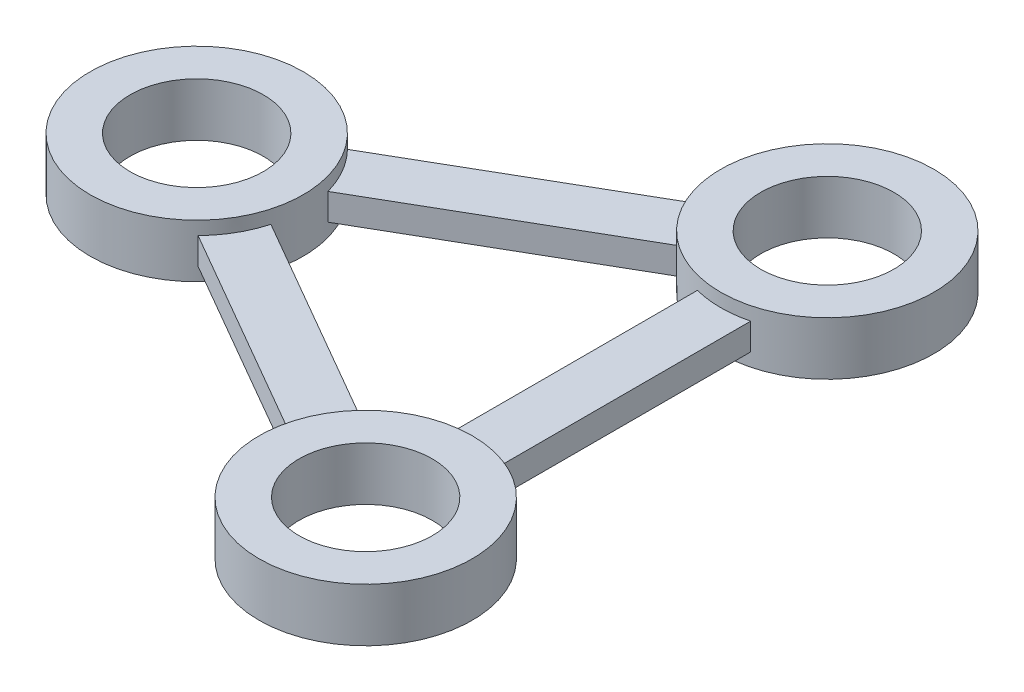
ISO-10303-21;
HEADER;
FILE_DESCRIPTION(('STEP AP214'),'2;1');
FILE_NAME('part.step','',(''),(''),'','','');
FILE_SCHEMA(('AUTOMOTIVE_DESIGN { 1 0 10303 214 1 1 1 1 }'));
ENDSEC;
DATA;
#1=APPLICATION_CONTEXT('core data for automotive mechanical design processes');
#2=APPLICATION_PROTOCOL_DEFINITION('international standard','automotive_design',2000,#1);
#3=PRODUCT_CONTEXT('',#1,'mechanical');
#4=PRODUCT('Part','Part','',(#3));
#5=PRODUCT_RELATED_PRODUCT_CATEGORY('part','',(#4));
#6=PRODUCT_DEFINITION_FORMATION('','',#4);
#7=PRODUCT_DEFINITION_CONTEXT('part definition',#1,'design');
#8=PRODUCT_DEFINITION('design','',#6,#7);
#9=PRODUCT_DEFINITION_SHAPE('','',#8);
#10=(LENGTH_UNIT() NAMED_UNIT(*) SI_UNIT(.MILLI.,.METRE.));
#11=(NAMED_UNIT(*) PLANE_ANGLE_UNIT() SI_UNIT($,.RADIAN.));
#12=(NAMED_UNIT(*) SI_UNIT($,.STERADIAN.) SOLID_ANGLE_UNIT());
#13=UNCERTAINTY_MEASURE_WITH_UNIT(LENGTH_MEASURE(1.E-05),#10,'distance_accuracy_value','');
#14=(GEOMETRIC_REPRESENTATION_CONTEXT(3) GLOBAL_UNCERTAINTY_ASSIGNED_CONTEXT((#13)) GLOBAL_UNIT_ASSIGNED_CONTEXT((#10,
#11,#12)) REPRESENTATION_CONTEXT('',''));
#15=CARTESIAN_POINT('',(0.,0.,0.));
#16=DIRECTION('',(0.,0.,1.));
#17=DIRECTION('',(1.,0.,0.));
#18=AXIS2_PLACEMENT_3D('',#15,#16,#17);
#19=CARTESIAN_POINT('',(-150.,-10.,0.));
#20=DIRECTION('',(0.,1.,0.));
#21=DIRECTION('',(0.,0.,1.));
#22=AXIS2_PLACEMENT_3D('',#19,#20,#21);
#23=CYLINDRICAL_SURFACE('',#22,40.);
#24=CARTESIAN_POINT('',(-150.,-10.,0.));
#25=DIRECTION('',(0.,1.,0.));
#26=DIRECTION('',(0.,0.,1.));
#27=AXIS2_PLACEMENT_3D('',#24,#25,#26);
#28=CIRCLE('',#27,40.);
#29=CARTESIAN_POINT('',(-150.,-10.,40.));
#30=VERTEX_POINT('',#29);
#31=EDGE_CURVE('E11',#30,#30,#28,.T.);
#32=ORIENTED_EDGE('',*,*,#31,.T.);
#33=EDGE_LOOP('',(#32));
#34=FACE_BOUND('',#33,.T.);
#35=CARTESIAN_POINT('',(-150.,10.,0.));
#36=DIRECTION('',(0.,1.,0.));
#37=DIRECTION('',(0.,0.,1.));
#38=AXIS2_PLACEMENT_3D('',#35,#36,#37);
#39=CIRCLE('',#38,40.);
#40=CARTESIAN_POINT('',(-150.,10.,40.));
#41=VERTEX_POINT('',#40);
#42=EDGE_CURVE('E296',#41,#41,#39,.T.);
#43=ORIENTED_EDGE('',*,*,#42,.F.);
#44=EDGE_LOOP('',(#43));
#45=FACE_BOUND('',#44,.T.);
#46=DIRECTION('',(0.,1.,0.));
#47=VECTOR('',#46,1.);
#48=CARTESIAN_POINT('',(-121.458624364497,-5.,-28.0248082390065));
#49=LINE('',#48,#47);
#50=CARTESIAN_POINT('',(-121.458624364497,-5.,-28.0248082390065));
#51=VERTEX_POINT('',#50);
#52=CARTESIAN_POINT('',(-121.458624364497,5.,-28.0248082390065));
#53=VERTEX_POINT('',#52);
#54=EDGE_CURVE('E279',#51,#53,#49,.T.);
#55=ORIENTED_EDGE('',*,*,#54,.F.);
#56=CARTESIAN_POINT('',(-150.,-5.,0.));
#57=DIRECTION('',(0.,-1.,0.));
#58=DIRECTION('',(0.,0.,1.));
#59=AXIS2_PLACEMENT_3D('',#56,#57,#58);
#60=CIRCLE('',#59,40.);
#61=CARTESIAN_POINT('',(-111.458844370143,-5.,-10.7041731448614));
#62=VERTEX_POINT('',#61);
#63=EDGE_CURVE('E264',#51,#62,#60,.T.);
#64=ORIENTED_EDGE('',*,*,#63,.T.);
#65=DIRECTION('',(0.,1.,0.));
#66=VECTOR('',#65,1.);
#67=CARTESIAN_POINT('',(-111.458844370143,-5.,-10.7041731448614));
#68=LINE('',#67,#66);
#69=CARTESIAN_POINT('',(-111.458844370143,5.,-10.7041731448614));
#70=VERTEX_POINT('',#69);
#71=EDGE_CURVE('E278',#62,#70,#68,.T.);
#72=ORIENTED_EDGE('',*,*,#71,.T.);
#73=CARTESIAN_POINT('',(-150.,5.,0.));
#74=DIRECTION('',(0.,-1.,0.));
#75=DIRECTION('',(0.,0.,1.));
#76=AXIS2_PLACEMENT_3D('',#73,#74,#75);
#77=CIRCLE('',#76,40.);
#78=EDGE_CURVE('E248',#53,#70,#77,.T.);
#79=ORIENTED_EDGE('',*,*,#78,.F.);
#80=EDGE_LOOP('',(#55,#64,#72,#79));
#81=FACE_BOUND('',#80,.T.);
#82=DIRECTION('',(0.,1.,0.));
#83=VECTOR('',#82,1.);
#84=CARTESIAN_POINT('',(-111.458844370143,-5.,10.7041731448613));
#85=LINE('',#84,#83);
#86=CARTESIAN_POINT('',(-111.458844370143,-5.,10.7041731448613));
#87=VERTEX_POINT('',#86);
#88=CARTESIAN_POINT('',(-111.458844370143,5.,10.7041731448613));
#89=VERTEX_POINT('',#88);
#90=EDGE_CURVE('E54',#87,#89,#85,.T.);
#91=ORIENTED_EDGE('',*,*,#90,.F.);
#92=CARTESIAN_POINT('',(-150.,-5.,0.));
#93=DIRECTION('',(0.,-1.,0.));
#94=DIRECTION('',(0.,0.,1.));
#95=AXIS2_PLACEMENT_3D('',#92,#93,#94);
#96=CIRCLE('',#95,40.);
#97=CARTESIAN_POINT('',(-121.458624364497,-5.,28.0248082390066));
#98=VERTEX_POINT('',#97);
#99=EDGE_CURVE('E58',#87,#98,#96,.T.);
#100=ORIENTED_EDGE('',*,*,#99,.T.);
#101=DIRECTION('',(0.,1.,0.));
#102=VECTOR('',#101,1.);
#103=CARTESIAN_POINT('',(-121.458624364497,-5.,28.0248082390066));
#104=LINE('',#103,#102);
#105=CARTESIAN_POINT('',(-121.458624364497,5.,28.0248082390066));
#106=VERTEX_POINT('',#105);
#107=EDGE_CURVE('E123',#98,#106,#104,.T.);
#108=ORIENTED_EDGE('',*,*,#107,.T.);
#109=CARTESIAN_POINT('',(-150.,5.,0.));
#110=DIRECTION('',(0.,-1.,0.));
#111=DIRECTION('',(0.,0.,1.));
#112=AXIS2_PLACEMENT_3D('',#109,#110,#111);
#113=CIRCLE('',#112,40.);
#114=EDGE_CURVE('E126',#89,#106,#113,.T.);
#115=ORIENTED_EDGE('',*,*,#114,.F.);
#116=EDGE_LOOP('',(#91,#100,#108,#115));
#117=FACE_BOUND('',#116,.T.);
#118=ADVANCED_FACE('F39',(#34,#45,#81,#117),#23,.T.);
#119=CARTESIAN_POINT('',(0.,-10.,86.6));
#120=DIRECTION('',(0.,1.,0.));
#121=DIRECTION('',(0.,0.,1.));
#122=AXIS2_PLACEMENT_3D('',#119,#120,#121);
#123=CYLINDRICAL_SURFACE('',#122,40.);
#124=CARTESIAN_POINT('',(0.,10.,86.6));
#125=DIRECTION('',(0.,1.,0.));
#126=DIRECTION('',(0.,0.,-1.));
#127=AXIS2_PLACEMENT_3D('',#124,#125,#126);
#128=CIRCLE('',#127,40.);
#129=CARTESIAN_POINT('',(0.,10.,46.6));
#130=VERTEX_POINT('',#129);
#131=EDGE_CURVE('E176',#130,#130,#128,.T.);
#132=ORIENTED_EDGE('',*,*,#131,.F.);
#133=EDGE_LOOP('',(#132));
#134=FACE_BOUND('',#133,.T.);
#135=CARTESIAN_POINT('',(0.,-10.,86.6));
#136=DIRECTION('',(0.,1.,0.));
#137=DIRECTION('',(0.,0.,-1.));
#138=AXIS2_PLACEMENT_3D('',#135,#136,#137);
#139=CIRCLE('',#138,40.);
#140=CARTESIAN_POINT('',(0.,-10.,46.6));
#141=VERTEX_POINT('',#140);
#142=EDGE_CURVE('E184',#141,#141,#139,.T.);
#143=ORIENTED_EDGE('',*,*,#142,.T.);
#144=EDGE_LOOP('',(#143));
#145=FACE_BOUND('',#144,.T.);
#146=CARTESIAN_POINT('',(0.,-5.,86.6));
#147=DIRECTION('',(0.,-1.,0.));
#148=DIRECTION('',(0.,0.,1.));
#149=AXIS2_PLACEMENT_3D('',#146,#147,#148);
#150=CIRCLE('',#149,40.);
#151=CARTESIAN_POINT('',(-9.99999999999998,-5.,47.8701665379258));
#152=VERTEX_POINT('',#151);
#153=CARTESIAN_POINT('',(10.,-5.,47.8701665379258));
#154=VERTEX_POINT('',#153);
#155=EDGE_CURVE('E211',#152,#154,#150,.T.);
#156=ORIENTED_EDGE('',*,*,#155,.T.);
#157=DIRECTION('',(0.,1.,0.));
#158=VECTOR('',#157,1.);
#159=CARTESIAN_POINT('',(10.,-5.,47.8701665379258));
#160=LINE('',#159,#158);
#161=CARTESIAN_POINT('',(10.,5.,47.8701665379258));
#162=VERTEX_POINT('',#161);
#163=EDGE_CURVE('E224',#154,#162,#160,.T.);
#164=ORIENTED_EDGE('',*,*,#163,.T.);
#165=CARTESIAN_POINT('',(0.,5.,86.6));
#166=DIRECTION('',(0.,-1.,0.));
#167=DIRECTION('',(0.,0.,1.));
#168=AXIS2_PLACEMENT_3D('',#165,#166,#167);
#169=CIRCLE('',#168,40.);
#170=CARTESIAN_POINT('',(-9.99999999999998,5.,47.8701665379258));
#171=VERTEX_POINT('',#170);
#172=EDGE_CURVE('E196',#171,#162,#169,.T.);
#173=ORIENTED_EDGE('',*,*,#172,.F.);
#174=DIRECTION('',(0.,1.,0.));
#175=VECTOR('',#174,1.);
#176=CARTESIAN_POINT('',(-9.99999999999998,-5.,47.8701665379258));
#177=LINE('',#176,#175);
#178=EDGE_CURVE('E227',#152,#171,#177,.T.);
#179=ORIENTED_EDGE('',*,*,#178,.F.);
#180=EDGE_LOOP('',(#156,#164,#173,#179));
#181=FACE_BOUND('',#180,.T.);
#182=DIRECTION('',(0.,1.,0.));
#183=VECTOR('',#182,1.);
#184=CARTESIAN_POINT('',(-38.5411556298567,-5.,75.8958268551386));
#185=LINE('',#184,#183);
#186=CARTESIAN_POINT('',(-38.5411556298567,-5.,75.8958268551386));
#187=VERTEX_POINT('',#186);
#188=CARTESIAN_POINT('',(-38.5411556298567,5.,75.8958268551386));
#189=VERTEX_POINT('',#188);
#190=EDGE_CURVE('E131',#187,#189,#185,.T.);
#191=ORIENTED_EDGE('',*,*,#190,.F.);
#192=CARTESIAN_POINT('',(0.,-5.,86.6));
#193=DIRECTION('',(0.,-1.,0.));
#194=DIRECTION('',(0.,0.,1.));
#195=AXIS2_PLACEMENT_3D('',#192,#193,#194);
#196=CIRCLE('',#195,40.);
#197=CARTESIAN_POINT('',(-28.5413756355035,-5.,58.5751917609934));
#198=VERTEX_POINT('',#197);
#199=EDGE_CURVE('E159',#187,#198,#196,.T.);
#200=ORIENTED_EDGE('',*,*,#199,.T.);
#201=DIRECTION('',(0.,1.,0.));
#202=VECTOR('',#201,1.);
#203=CARTESIAN_POINT('',(-28.5413756355035,-5.,58.5751917609934));
#204=LINE('',#203,#202);
#205=CARTESIAN_POINT('',(-28.5413756355035,5.,58.5751917609934));
#206=VERTEX_POINT('',#205);
#207=EDGE_CURVE('E168',#198,#206,#204,.T.);
#208=ORIENTED_EDGE('',*,*,#207,.T.);
#209=CARTESIAN_POINT('',(0.,5.,86.6));
#210=DIRECTION('',(0.,-1.,0.));
#211=DIRECTION('',(0.,0.,1.));
#212=AXIS2_PLACEMENT_3D('',#209,#210,#211);
#213=CIRCLE('',#212,40.);
#214=EDGE_CURVE('E141',#189,#206,#213,.T.);
#215=ORIENTED_EDGE('',*,*,#214,.F.);
#216=EDGE_LOOP('',(#191,#200,#208,#215));
#217=FACE_BOUND('',#216,.T.);
#218=ADVANCED_FACE('F325',(#134,#145,#181,#217),#123,.T.);
#219=CARTESIAN_POINT('',(0.,-10.,-86.6));
#220=DIRECTION('',(0.,1.,0.));
#221=DIRECTION('',(0.,0.,1.));
#222=AXIS2_PLACEMENT_3D('',#219,#220,#221);
#223=CYLINDRICAL_SURFACE('',#222,40.);
#224=CARTESIAN_POINT('',(0.,10.,-86.6));
#225=DIRECTION('',(0.,1.,0.));
#226=DIRECTION('',(0.,0.,1.));
#227=AXIS2_PLACEMENT_3D('',#224,#225,#226);
#228=CIRCLE('',#227,40.);
#229=CARTESIAN_POINT('',(0.,10.,-46.6));
#230=VERTEX_POINT('',#229);
#231=EDGE_CURVE('E236',#230,#230,#228,.T.);
#232=ORIENTED_EDGE('',*,*,#231,.F.);
#233=EDGE_LOOP('',(#232));
#234=FACE_BOUND('',#233,.T.);
#235=CARTESIAN_POINT('',(0.,-10.,-86.6));
#236=DIRECTION('',(0.,1.,0.));
#237=DIRECTION('',(0.,0.,1.));
#238=AXIS2_PLACEMENT_3D('',#235,#236,#237);
#239=CIRCLE('',#238,40.);
#240=CARTESIAN_POINT('',(0.,-10.,-46.6));
#241=VERTEX_POINT('',#240);
#242=EDGE_CURVE('E244',#241,#241,#239,.T.);
#243=ORIENTED_EDGE('',*,*,#242,.T.);
#244=EDGE_LOOP('',(#243));
#245=FACE_BOUND('',#244,.T.);
#246=CARTESIAN_POINT('',(0.,-5.,-86.6));
#247=DIRECTION('',(0.,-1.,0.));
#248=DIRECTION('',(0.,0.,1.));
#249=AXIS2_PLACEMENT_3D('',#246,#247,#248);
#250=CIRCLE('',#249,40.);
#251=CARTESIAN_POINT('',(-28.5413756355035,-5.,-58.5751917609934));
#252=VERTEX_POINT('',#251);
#253=CARTESIAN_POINT('',(-38.5411556298567,-5.,-75.8958268551386));
#254=VERTEX_POINT('',#253);
#255=EDGE_CURVE('E271',#252,#254,#250,.T.);
#256=ORIENTED_EDGE('',*,*,#255,.T.);
#257=DIRECTION('',(0.,1.,0.));
#258=VECTOR('',#257,1.);
#259=CARTESIAN_POINT('',(-38.5411556298567,-5.,-75.8958268551386));
#260=LINE('',#259,#258);
#261=CARTESIAN_POINT('',(-38.5411556298567,5.,-75.8958268551386));
#262=VERTEX_POINT('',#261);
#263=EDGE_CURVE('E284',#254,#262,#260,.T.);
#264=ORIENTED_EDGE('',*,*,#263,.T.);
#265=CARTESIAN_POINT('',(0.,5.,-86.6));
#266=DIRECTION('',(0.,-1.,0.));
#267=DIRECTION('',(0.,0.,1.));
#268=AXIS2_PLACEMENT_3D('',#265,#266,#267);
#269=CIRCLE('',#268,40.);
#270=CARTESIAN_POINT('',(-28.5413756355035,5.,-58.5751917609934));
#271=VERTEX_POINT('',#270);
#272=EDGE_CURVE('E256',#271,#262,#269,.T.);
#273=ORIENTED_EDGE('',*,*,#272,.F.);
#274=DIRECTION('',(0.,1.,0.));
#275=VECTOR('',#274,1.);
#276=CARTESIAN_POINT('',(-28.5413756355035,-5.,-58.5751917609934));
#277=LINE('',#276,#275);
#278=EDGE_CURVE('E287',#252,#271,#277,.T.);
#279=ORIENTED_EDGE('',*,*,#278,.F.);
#280=EDGE_LOOP('',(#256,#264,#273,#279));
#281=FACE_BOUND('',#280,.T.);
#282=DIRECTION('',(0.,1.,0.));
#283=VECTOR('',#282,1.);
#284=CARTESIAN_POINT('',(10.,-5.,-47.8701665379258));
#285=LINE('',#284,#283);
#286=CARTESIAN_POINT('',(10.,-5.,-47.8701665379258));
#287=VERTEX_POINT('',#286);
#288=CARTESIAN_POINT('',(10.,5.,-47.8701665379258));
#289=VERTEX_POINT('',#288);
#290=EDGE_CURVE('E219',#287,#289,#285,.T.);
#291=ORIENTED_EDGE('',*,*,#290,.F.);
#292=CARTESIAN_POINT('',(0.,-5.,-86.6));
#293=DIRECTION('',(0.,-1.,0.));
#294=DIRECTION('',(0.,0.,1.));
#295=AXIS2_PLACEMENT_3D('',#292,#293,#294);
#296=CIRCLE('',#295,40.);
#297=CARTESIAN_POINT('',(-9.99999999999999,-5.,-47.8701665379258));
#298=VERTEX_POINT('',#297);
#299=EDGE_CURVE('E204',#287,#298,#296,.T.);
#300=ORIENTED_EDGE('',*,*,#299,.T.);
#301=DIRECTION('',(0.,1.,0.));
#302=VECTOR('',#301,1.);
#303=CARTESIAN_POINT('',(-9.99999999999999,-5.,-47.8701665379258));
#304=LINE('',#303,#302);
#305=CARTESIAN_POINT('',(-9.99999999999999,5.,-47.8701665379258));
#306=VERTEX_POINT('',#305);
#307=EDGE_CURVE('E218',#298,#306,#304,.T.);
#308=ORIENTED_EDGE('',*,*,#307,.T.);
#309=CARTESIAN_POINT('',(0.,5.,-86.6));
#310=DIRECTION('',(0.,-1.,0.));
#311=DIRECTION('',(0.,0.,1.));
#312=AXIS2_PLACEMENT_3D('',#309,#310,#311);
#313=CIRCLE('',#312,40.);
#314=EDGE_CURVE('E188',#289,#306,#313,.T.);
#315=ORIENTED_EDGE('',*,*,#314,.F.);
#316=EDGE_LOOP('',(#291,#300,#308,#315));
#317=FACE_BOUND('',#316,.T.);
#318=ADVANCED_FACE('F330',(#234,#245,#281,#317),#223,.T.);
#319=CARTESIAN_POINT('',(-150.,-10.,0.));
#320=DIRECTION('',(0.,1.,0.));
#321=DIRECTION('',(0.,0.,1.));
#322=AXIS2_PLACEMENT_3D('',#319,#320,#321);
#323=PLANE('',#322);
#324=CARTESIAN_POINT('',(-150.,-10.,0.));
#325=DIRECTION('',(0.,1.,0.));
#326=DIRECTION('',(0.,0.,1.));
#327=AXIS2_PLACEMENT_3D('',#324,#325,#326);
#328=CIRCLE('',#327,25.);
#329=CARTESIAN_POINT('',(-150.,-10.,25.));
#330=VERTEX_POINT('',#329);
#331=EDGE_CURVE('E47',#330,#330,#328,.T.);
#332=ORIENTED_EDGE('',*,*,#331,.T.);
#333=EDGE_LOOP('',(#332));
#334=FACE_BOUND('',#333,.T.);
#335=ORIENTED_EDGE('',*,*,#31,.F.);
#336=EDGE_LOOP('',(#335));
#337=FACE_BOUND('',#336,.T.);
#338=ADVANCED_FACE('F303',(#334,#337),#323,.F.);
#339=CARTESIAN_POINT('',(-150.,-10.,0.));
#340=DIRECTION('',(0.,1.,0.));
#341=DIRECTION('',(0.,0.,1.));
#342=AXIS2_PLACEMENT_3D('',#339,#340,#341);
#343=CYLINDRICAL_SURFACE('',#342,25.);
#344=ORIENTED_EDGE('',*,*,#331,.F.);
#345=EDGE_LOOP('',(#344));
#346=FACE_BOUND('',#345,.T.);
#347=CARTESIAN_POINT('',(-150.,10.,0.));
#348=DIRECTION('',(0.,1.,0.));
#349=DIRECTION('',(0.,0.,1.));
#350=AXIS2_PLACEMENT_3D('',#347,#348,#349);
#351=CIRCLE('',#350,25.);
#352=CARTESIAN_POINT('',(-150.,10.,25.));
#353=VERTEX_POINT('',#352);
#354=EDGE_CURVE('E283',#353,#353,#351,.T.);
#355=ORIENTED_EDGE('',*,*,#354,.T.);
#356=EDGE_LOOP('',(#355));
#357=FACE_BOUND('',#356,.T.);
#358=ADVANCED_FACE('F306',(#346,#357),#343,.F.);
#359=CARTESIAN_POINT('',(-150.,10.,0.));
#360=DIRECTION('',(0.,1.,0.));
#361=DIRECTION('',(0.,0.,1.));
#362=AXIS2_PLACEMENT_3D('',#359,#360,#361);
#363=PLANE('',#362);
#364=ORIENTED_EDGE('',*,*,#42,.T.);
#365=EDGE_LOOP('',(#364));
#366=FACE_BOUND('',#365,.T.);
#367=ORIENTED_EDGE('',*,*,#354,.F.);
#368=EDGE_LOOP('',(#367));
#369=FACE_BOUND('',#368,.T.);
#370=ADVANCED_FACE('F309',(#366,#369),#363,.T.);
#371=CARTESIAN_POINT('',(-121.458624364497,-5.,-28.0248082390065));
#372=DIRECTION('',(-0.499988999717658,0.,-0.86603175470726));
#373=DIRECTION('',(-0.86603175470726,0.,0.499988999717658));
#374=AXIS2_PLACEMENT_3D('',#371,#372,#373);
#375=PLANE('',#374);
#376=ORIENTED_EDGE('',*,*,#54,.T.);
#377=DIRECTION('',(-0.86603175470726,0.,0.499988999717658));
#378=VECTOR('',#377,1.);
#379=CARTESIAN_POINT('',(-121.458624364497,5.,-28.0248082390065));
#380=LINE('',#379,#378);
#381=EDGE_CURVE('E260',#262,#53,#380,.T.);
#382=ORIENTED_EDGE('',*,*,#381,.F.);
#383=ORIENTED_EDGE('',*,*,#263,.F.);
#384=DIRECTION('',(-0.86603175470726,0.,0.499988999717658));
#385=VECTOR('',#384,1.);
#386=CARTESIAN_POINT('',(-121.458624364497,-5.,-28.0248082390065));
#387=LINE('',#386,#385);
#388=EDGE_CURVE('E274',#254,#51,#387,.T.);
#389=ORIENTED_EDGE('',*,*,#388,.T.);
#390=EDGE_LOOP('',(#376,#382,#383,#389));
#391=FACE_BOUND('',#390,.T.);
#392=ADVANCED_FACE('F314',(#391),#375,.T.);
#393=CARTESIAN_POINT('',(-111.458844370143,-5.,-10.7041731448614));
#394=DIRECTION('',(0.499988999717658,0.,0.86603175470726));
#395=DIRECTION('',(0.86603175470726,0.,-0.499988999717658));
#396=AXIS2_PLACEMENT_3D('',#393,#394,#395);
#397=PLANE('',#396);
#398=ORIENTED_EDGE('',*,*,#278,.T.);
#399=DIRECTION('',(0.86603175470726,0.,-0.499988999717658));
#400=VECTOR('',#399,1.);
#401=CARTESIAN_POINT('',(-111.458844370143,5.,-10.7041731448614));
#402=LINE('',#401,#400);
#403=EDGE_CURVE('E252',#70,#271,#402,.T.);
#404=ORIENTED_EDGE('',*,*,#403,.F.);
#405=ORIENTED_EDGE('',*,*,#71,.F.);
#406=DIRECTION('',(0.86603175470726,0.,-0.499988999717658));
#407=VECTOR('',#406,1.);
#408=CARTESIAN_POINT('',(-111.458844370143,-5.,-10.7041731448614));
#409=LINE('',#408,#407);
#410=EDGE_CURVE('E267',#62,#252,#409,.T.);
#411=ORIENTED_EDGE('',*,*,#410,.T.);
#412=EDGE_LOOP('',(#398,#404,#405,#411));
#413=FACE_BOUND('',#412,.T.);
#414=ADVANCED_FACE('F320',(#413),#397,.T.);
#415=CARTESIAN_POINT('',(-150.,-5.,0.));
#416=DIRECTION('',(0.,1.,0.));
#417=DIRECTION('',(0.,0.,1.));
#418=AXIS2_PLACEMENT_3D('',#415,#416,#417);
#419=PLANE('',#418);
#420=ORIENTED_EDGE('',*,*,#63,.F.);
#421=ORIENTED_EDGE('',*,*,#388,.F.);
#422=ORIENTED_EDGE('',*,*,#255,.F.);
#423=ORIENTED_EDGE('',*,*,#410,.F.);
#424=EDGE_LOOP('',(#420,#421,#422,#423));
#425=FACE_BOUND('',#424,.T.);
#426=ADVANCED_FACE('F343',(#425),#419,.F.);
#427=CARTESIAN_POINT('',(-150.,5.,0.));
#428=DIRECTION('',(0.,1.,0.));
#429=DIRECTION('',(0.,0.,1.));
#430=AXIS2_PLACEMENT_3D('',#427,#428,#429);
#431=PLANE('',#430);
#432=ORIENTED_EDGE('',*,*,#78,.T.);
#433=ORIENTED_EDGE('',*,*,#403,.T.);
#434=ORIENTED_EDGE('',*,*,#272,.T.);
#435=ORIENTED_EDGE('',*,*,#381,.T.);
#436=EDGE_LOOP('',(#432,#433,#434,#435));
#437=FACE_BOUND('',#436,.T.);
#438=ADVANCED_FACE('F349',(#437),#431,.T.);
#439=CARTESIAN_POINT('',(0.,-10.,-86.6));
#440=DIRECTION('',(0.,1.,0.));
#441=DIRECTION('',(0.,0.,1.));
#442=AXIS2_PLACEMENT_3D('',#439,#440,#441);
#443=PLANE('',#442);
#444=CARTESIAN_POINT('',(0.,-10.,-86.6));
#445=DIRECTION('',(0.,1.,0.));
#446=DIRECTION('',(0.,0.,1.));
#447=AXIS2_PLACEMENT_3D('',#444,#445,#446);
#448=CIRCLE('',#447,25.);
#449=CARTESIAN_POINT('',(0.,-10.,-61.6));
#450=VERTEX_POINT('',#449);
#451=EDGE_CURVE('E240',#450,#450,#448,.T.);
#452=ORIENTED_EDGE('',*,*,#451,.T.);
#453=EDGE_LOOP('',(#452));
#454=FACE_BOUND('',#453,.T.);
#455=ORIENTED_EDGE('',*,*,#242,.F.);
#456=EDGE_LOOP('',(#455));
#457=FACE_BOUND('',#456,.T.);
#458=ADVANCED_FACE('F360',(#454,#457),#443,.F.);
#459=CARTESIAN_POINT('',(0.,-10.,-86.6));
#460=DIRECTION('',(0.,1.,0.));
#461=DIRECTION('',(0.,0.,1.));
#462=AXIS2_PLACEMENT_3D('',#459,#460,#461);
#463=CYLINDRICAL_SURFACE('',#462,25.);
#464=ORIENTED_EDGE('',*,*,#451,.F.);
#465=EDGE_LOOP('',(#464));
#466=FACE_BOUND('',#465,.T.);
#467=CARTESIAN_POINT('',(0.,10.,-86.6));
#468=DIRECTION('',(0.,1.,0.));
#469=DIRECTION('',(0.,0.,1.));
#470=AXIS2_PLACEMENT_3D('',#467,#468,#469);
#471=CIRCLE('',#470,25.);
#472=CARTESIAN_POINT('',(0.,10.,-61.6));
#473=VERTEX_POINT('',#472);
#474=EDGE_CURVE('E223',#473,#473,#471,.T.);
#475=ORIENTED_EDGE('',*,*,#474,.T.);
#476=EDGE_LOOP('',(#475));
#477=FACE_BOUND('',#476,.T.);
#478=ADVANCED_FACE('F366',(#466,#477),#463,.F.);
#479=CARTESIAN_POINT('',(0.,10.,-86.6));
#480=DIRECTION('',(0.,1.,0.));
#481=DIRECTION('',(0.,0.,1.));
#482=AXIS2_PLACEMENT_3D('',#479,#480,#481);
#483=PLANE('',#482);
#484=ORIENTED_EDGE('',*,*,#231,.T.);
#485=EDGE_LOOP('',(#484));
#486=FACE_BOUND('',#485,.T.);
#487=ORIENTED_EDGE('',*,*,#474,.F.);
#488=EDGE_LOOP('',(#487));
#489=FACE_BOUND('',#488,.T.);
#490=ADVANCED_FACE('F370',(#486,#489),#483,.T.);
#491=CARTESIAN_POINT('',(10.,-5.,-47.8701665379258));
#492=DIRECTION('',(1.,0.,0.));
#493=DIRECTION('',(0.,0.,-1.));
#494=AXIS2_PLACEMENT_3D('',#491,#492,#493);
#495=PLANE('',#494);
#496=ORIENTED_EDGE('',*,*,#290,.T.);
#497=DIRECTION('',(0.,0.,-1.));
#498=VECTOR('',#497,1.);
#499=CARTESIAN_POINT('',(10.,5.,-47.8701665379258));
#500=LINE('',#499,#498);
#501=EDGE_CURVE('E200',#162,#289,#500,.T.);
#502=ORIENTED_EDGE('',*,*,#501,.F.);
#503=ORIENTED_EDGE('',*,*,#163,.F.);
#504=DIRECTION('',(0.,0.,-1.));
#505=VECTOR('',#504,1.);
#506=CARTESIAN_POINT('',(10.,-5.,-47.8701665379258));
#507=LINE('',#506,#505);
#508=EDGE_CURVE('E214',#154,#287,#507,.T.);
#509=ORIENTED_EDGE('',*,*,#508,.T.);
#510=EDGE_LOOP('',(#496,#502,#503,#509));
#511=FACE_BOUND('',#510,.T.);
#512=ADVANCED_FACE('F374',(#511),#495,.T.);
#513=CARTESIAN_POINT('',(-9.99999999999999,-5.,-47.8701665379258));
#514=DIRECTION('',(-1.,0.,0.));
#515=DIRECTION('',(0.,0.,1.));
#516=AXIS2_PLACEMENT_3D('',#513,#514,#515);
#517=PLANE('',#516);
#518=ORIENTED_EDGE('',*,*,#178,.T.);
#519=DIRECTION('',(0.,0.,1.));
#520=VECTOR('',#519,1.);
#521=CARTESIAN_POINT('',(-9.99999999999999,5.,-47.8701665379258));
#522=LINE('',#521,#520);
#523=EDGE_CURVE('E192',#306,#171,#522,.T.);
#524=ORIENTED_EDGE('',*,*,#523,.F.);
#525=ORIENTED_EDGE('',*,*,#307,.F.);
#526=DIRECTION('',(0.,0.,1.));
#527=VECTOR('',#526,1.);
#528=CARTESIAN_POINT('',(-9.99999999999999,-5.,-47.8701665379258));
#529=LINE('',#528,#527);
#530=EDGE_CURVE('E207',#298,#152,#529,.T.);
#531=ORIENTED_EDGE('',*,*,#530,.T.);
#532=EDGE_LOOP('',(#518,#524,#525,#531));
#533=FACE_BOUND('',#532,.T.);
#534=ADVANCED_FACE('F376',(#533),#517,.T.);
#535=CARTESIAN_POINT('',(0.,-5.,-86.6));
#536=DIRECTION('',(0.,1.,0.));
#537=DIRECTION('',(0.,0.,1.));
#538=AXIS2_PLACEMENT_3D('',#535,#536,#537);
#539=PLANE('',#538);
#540=ORIENTED_EDGE('',*,*,#299,.F.);
#541=ORIENTED_EDGE('',*,*,#508,.F.);
#542=ORIENTED_EDGE('',*,*,#155,.F.);
#543=ORIENTED_EDGE('',*,*,#530,.F.);
#544=EDGE_LOOP('',(#540,#541,#542,#543));
#545=FACE_BOUND('',#544,.T.);
#546=ADVANCED_FACE('F379',(#545),#539,.F.);
#547=CARTESIAN_POINT('',(0.,5.,-86.6));
#548=DIRECTION('',(0.,1.,0.));
#549=DIRECTION('',(0.,0.,1.));
#550=AXIS2_PLACEMENT_3D('',#547,#548,#549);
#551=PLANE('',#550);
#552=ORIENTED_EDGE('',*,*,#314,.T.);
#553=ORIENTED_EDGE('',*,*,#523,.T.);
#554=ORIENTED_EDGE('',*,*,#172,.T.);
#555=ORIENTED_EDGE('',*,*,#501,.T.);
#556=EDGE_LOOP('',(#552,#553,#554,#555));
#557=FACE_BOUND('',#556,.T.);
#558=ADVANCED_FACE('F386',(#557),#551,.T.);
#559=CARTESIAN_POINT('',(0.,-10.,86.6));
#560=DIRECTION('',(0.,-1.,0.));
#561=DIRECTION('',(0.,0.,-1.));
#562=AXIS2_PLACEMENT_3D('',#559,#560,#561);
#563=PLANE('',#562);
#564=CARTESIAN_POINT('',(0.,-10.,86.6));
#565=DIRECTION('',(0.,1.,0.));
#566=DIRECTION('',(0.,0.,-1.));
#567=AXIS2_PLACEMENT_3D('',#564,#565,#566);
#568=CIRCLE('',#567,25.);
#569=CARTESIAN_POINT('',(0.,-10.,61.6));
#570=VERTEX_POINT('',#569);
#571=EDGE_CURVE('E180',#570,#570,#568,.T.);
#572=ORIENTED_EDGE('',*,*,#571,.T.);
#573=EDGE_LOOP('',(#572));
#574=FACE_BOUND('',#573,.T.);
#575=ORIENTED_EDGE('',*,*,#142,.F.);
#576=EDGE_LOOP('',(#575));
#577=FACE_BOUND('',#576,.T.);
#578=ADVANCED_FACE('F389',(#574,#577),#563,.T.);
#579=CARTESIAN_POINT('',(0.,-10.,86.6));
#580=DIRECTION('',(0.,1.,0.));
#581=DIRECTION('',(0.,0.,1.));
#582=AXIS2_PLACEMENT_3D('',#579,#580,#581);
#583=CYLINDRICAL_SURFACE('',#582,25.);
#584=ORIENTED_EDGE('',*,*,#571,.F.);
#585=EDGE_LOOP('',(#584));
#586=FACE_BOUND('',#585,.T.);
#587=CARTESIAN_POINT('',(0.,10.,86.6));
#588=DIRECTION('',(0.,1.,0.));
#589=DIRECTION('',(0.,0.,-1.));
#590=AXIS2_PLACEMENT_3D('',#587,#588,#589);
#591=CIRCLE('',#590,25.);
#592=CARTESIAN_POINT('',(0.,10.,61.6));
#593=VERTEX_POINT('',#592);
#594=EDGE_CURVE('E167',#593,#593,#591,.T.);
#595=ORIENTED_EDGE('',*,*,#594,.T.);
#596=EDGE_LOOP('',(#595));
#597=FACE_BOUND('',#596,.T.);
#598=ADVANCED_FACE('F394',(#586,#597),#583,.F.);
#599=CARTESIAN_POINT('',(0.,10.,86.6));
#600=DIRECTION('',(0.,-1.,0.));
#601=DIRECTION('',(0.,0.,-1.));
#602=AXIS2_PLACEMENT_3D('',#599,#600,#601);
#603=PLANE('',#602);
#604=ORIENTED_EDGE('',*,*,#131,.T.);
#605=EDGE_LOOP('',(#604));
#606=FACE_BOUND('',#605,.T.);
#607=ORIENTED_EDGE('',*,*,#594,.F.);
#608=EDGE_LOOP('',(#607));
#609=FACE_BOUND('',#608,.T.);
#610=ADVANCED_FACE('F398',(#606,#609),#603,.F.);
#611=CARTESIAN_POINT('',(-111.458844370143,-5.,10.7041731448613));
#612=DIRECTION('',(0.499988999717658,0.,-0.86603175470726));
#613=DIRECTION('',(-0.86603175470726,0.,-0.499988999717658));
#614=AXIS2_PLACEMENT_3D('',#611,#612,#613);
#615=PLANE('',#614);
#616=ORIENTED_EDGE('',*,*,#90,.T.);
#617=DIRECTION('',(-0.86603175470726,0.,-0.499988999717658));
#618=VECTOR('',#617,1.);
#619=CARTESIAN_POINT('',(-111.458844370143,5.,10.7041731448613));
#620=LINE('',#619,#618);
#621=EDGE_CURVE('E146',#206,#89,#620,.T.);
#622=ORIENTED_EDGE('',*,*,#621,.F.);
#623=ORIENTED_EDGE('',*,*,#207,.F.);
#624=DIRECTION('',(-0.86603175470726,0.,-0.499988999717658));
#625=VECTOR('',#624,1.);
#626=CARTESIAN_POINT('',(-111.458844370143,-5.,10.7041731448613));
#627=LINE('',#626,#625);
#628=EDGE_CURVE('E132',#198,#87,#627,.T.);
#629=ORIENTED_EDGE('',*,*,#628,.T.);
#630=EDGE_LOOP('',(#616,#622,#623,#629));
#631=FACE_BOUND('',#630,.T.);
#632=ADVANCED_FACE('F402',(#631),#615,.T.);
#633=CARTESIAN_POINT('',(-121.458624364497,-5.,28.0248082390066));
#634=DIRECTION('',(-0.499988999717658,0.,0.86603175470726));
#635=DIRECTION('',(0.86603175470726,0.,0.499988999717658));
#636=AXIS2_PLACEMENT_3D('',#633,#634,#635);
#637=PLANE('',#636);
#638=ORIENTED_EDGE('',*,*,#190,.T.);
#639=DIRECTION('',(0.86603175470726,0.,0.499988999717658));
#640=VECTOR('',#639,1.);
#641=CARTESIAN_POINT('',(-121.458624364497,5.,28.0248082390066));
#642=LINE('',#641,#640);
#643=EDGE_CURVE('E136',#106,#189,#642,.T.);
#644=ORIENTED_EDGE('',*,*,#643,.F.);
#645=ORIENTED_EDGE('',*,*,#107,.F.);
#646=DIRECTION('',(0.86603175470726,0.,0.499988999717658));
#647=VECTOR('',#646,1.);
#648=CARTESIAN_POINT('',(-121.458624364497,-5.,28.0248082390066));
#649=LINE('',#648,#647);
#650=EDGE_CURVE('E156',#98,#187,#649,.T.);
#651=ORIENTED_EDGE('',*,*,#650,.T.);
#652=EDGE_LOOP('',(#638,#644,#645,#651));
#653=FACE_BOUND('',#652,.T.);
#654=ADVANCED_FACE('F137',(#653),#637,.T.);
#655=CARTESIAN_POINT('',(-150.,-5.,0.));
#656=DIRECTION('',(0.,1.,0.));
#657=DIRECTION('',(0.,0.,1.));
#658=AXIS2_PLACEMENT_3D('',#655,#656,#657);
#659=PLANE('',#658);
#660=ORIENTED_EDGE('',*,*,#99,.F.);
#661=ORIENTED_EDGE('',*,*,#628,.F.);
#662=ORIENTED_EDGE('',*,*,#199,.F.);
#663=ORIENTED_EDGE('',*,*,#650,.F.);
#664=EDGE_LOOP('',(#660,#661,#662,#663));
#665=FACE_BOUND('',#664,.T.);
#666=ADVANCED_FACE('F406',(#665),#659,.F.);
#667=CARTESIAN_POINT('',(-150.,5.,0.));
#668=DIRECTION('',(0.,1.,0.));
#669=DIRECTION('',(0.,0.,1.));
#670=AXIS2_PLACEMENT_3D('',#667,#668,#669);
#671=PLANE('',#670);
#672=ORIENTED_EDGE('',*,*,#114,.T.);
#673=ORIENTED_EDGE('',*,*,#643,.T.);
#674=ORIENTED_EDGE('',*,*,#214,.T.);
#675=ORIENTED_EDGE('',*,*,#621,.T.);
#676=EDGE_LOOP('',(#672,#673,#674,#675));
#677=FACE_BOUND('',#676,.T.);
#678=ADVANCED_FACE('F144',(#677),#671,.T.);
#679=CLOSED_SHELL('',(#118,#218,#318,#338,#358,#370,#392,#414,#426,#438,#458,#478,#490,#512,
#534,#546,#558,#578,#598,#610,#632,#654,#666,#678));
#680=MANIFOLD_SOLID_BREP('B2',#679);
#681=ADVANCED_BREP_SHAPE_REPRESENTATION('',(#18,#680),#14);
#682=SHAPE_DEFINITION_REPRESENTATION(#9,#681);
ENDSEC;
END-ISO-10303-21;
